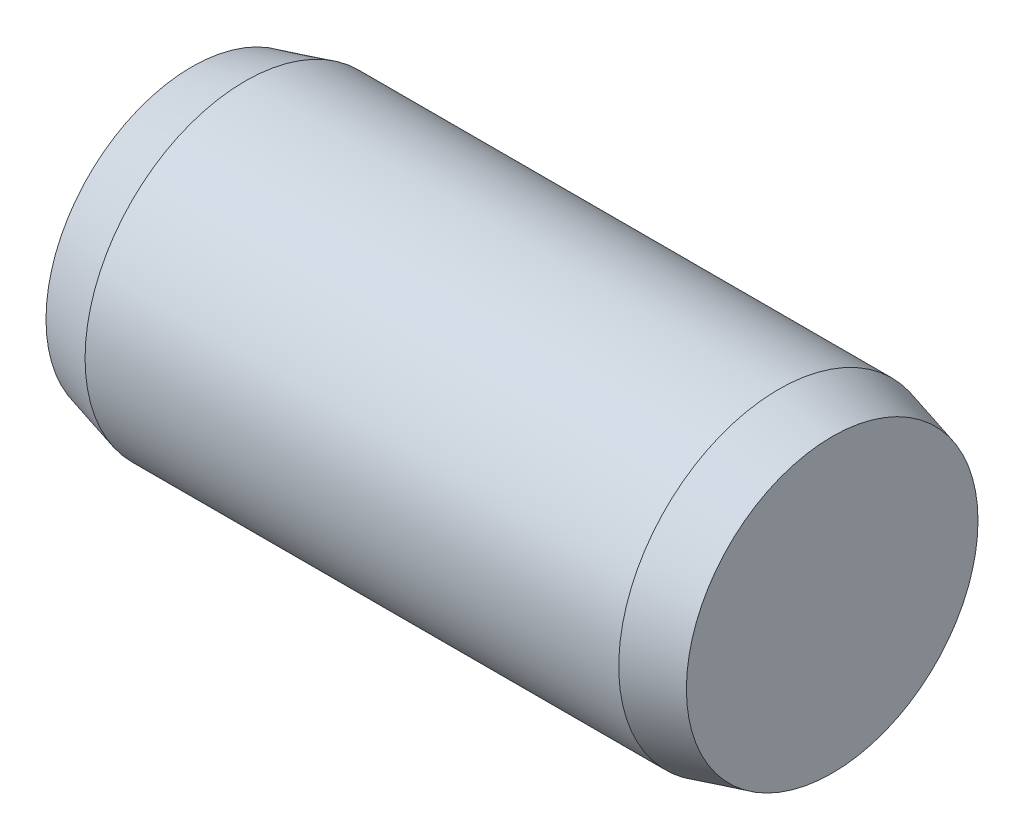
ISO-10303-21;
HEADER;
FILE_DESCRIPTION(('STEP AP214'),'2;1');
FILE_NAME('part.step','',(''),(''),'','','');
FILE_SCHEMA(('AUTOMOTIVE_DESIGN { 1 0 10303 214 1 1 1 1 }'));
ENDSEC;
DATA;
#1=APPLICATION_CONTEXT('core data for automotive mechanical design processes');
#2=APPLICATION_PROTOCOL_DEFINITION('international standard','automotive_design',2000,#1);
#3=PRODUCT_CONTEXT('',#1,'mechanical');
#4=PRODUCT('Part','Part','',(#3));
#5=PRODUCT_RELATED_PRODUCT_CATEGORY('part','',(#4));
#6=PRODUCT_DEFINITION_FORMATION('','',#4);
#7=PRODUCT_DEFINITION_CONTEXT('part definition',#1,'design');
#8=PRODUCT_DEFINITION('design','',#6,#7);
#9=PRODUCT_DEFINITION_SHAPE('','',#8);
#10=(LENGTH_UNIT() NAMED_UNIT(*) SI_UNIT(.MILLI.,.METRE.));
#11=(NAMED_UNIT(*) PLANE_ANGLE_UNIT() SI_UNIT($,.RADIAN.));
#12=(NAMED_UNIT(*) SI_UNIT($,.STERADIAN.) SOLID_ANGLE_UNIT());
#13=UNCERTAINTY_MEASURE_WITH_UNIT(LENGTH_MEASURE(1.E-05),#10,'distance_accuracy_value','');
#14=(GEOMETRIC_REPRESENTATION_CONTEXT(3) GLOBAL_UNCERTAINTY_ASSIGNED_CONTEXT((#13)) GLOBAL_UNIT_ASSIGNED_CONTEXT((#10,
#11,#12)) REPRESENTATION_CONTEXT('',''));
#15=CARTESIAN_POINT('',(0.,0.,0.));
#16=DIRECTION('',(0.,0.,1.));
#17=DIRECTION('',(1.,0.,0.));
#18=AXIS2_PLACEMENT_3D('',#15,#16,#17);
#19=CARTESIAN_POINT('',(-2.5,0.,0.));
#20=DIRECTION('',(1.,0.,0.));
#21=DIRECTION('',(0.,0.,-1.));
#22=AXIS2_PLACEMENT_3D('',#19,#20,#21);
#23=CYLINDRICAL_SURFACE('',#22,1.5);
#24=CARTESIAN_POINT('',(-2.5,0.,0.));
#25=DIRECTION('',(-1.,0.,0.));
#26=DIRECTION('',(0.,0.,1.));
#27=AXIS2_PLACEMENT_3D('',#24,#25,#26);
#28=CIRCLE('',#27,1.5);
#29=CARTESIAN_POINT('',(-2.5,0.,1.5));
#30=VERTEX_POINT('',#29);
#31=EDGE_CURVE('E44',#30,#30,#28,.T.);
#32=ORIENTED_EDGE('',*,*,#31,.F.);
#33=EDGE_LOOP('',(#32));
#34=FACE_BOUND('',#33,.T.);
#35=CARTESIAN_POINT('',(2.5,0.,0.));
#36=DIRECTION('',(1.,0.,0.));
#37=DIRECTION('',(0.,0.,-1.));
#38=AXIS2_PLACEMENT_3D('',#35,#36,#37);
#39=CIRCLE('',#38,1.5);
#40=CARTESIAN_POINT('',(2.5,0.,-1.5));
#41=VERTEX_POINT('',#40);
#42=EDGE_CURVE('E10',#41,#41,#39,.T.);
#43=ORIENTED_EDGE('',*,*,#42,.F.);
#44=EDGE_LOOP('',(#43));
#45=FACE_BOUND('',#44,.T.);
#46=ADVANCED_FACE('F30',(#34,#45),#23,.T.);
#47=CARTESIAN_POINT('',(2.5,0.,0.));
#48=DIRECTION('',(-1.,0.,0.));
#49=DIRECTION('',(0.,0.,-1.));
#50=AXIS2_PLACEMENT_3D('',#47,#48,#49);
#51=CONICAL_SURFACE('',#50,1.5,0.26179938779915);
#52=CARTESIAN_POINT('',(3.,0.,0.));
#53=DIRECTION('',(1.,0.,0.));
#54=DIRECTION('',(0.,0.,-1.));
#55=AXIS2_PLACEMENT_3D('',#52,#53,#54);
#56=CIRCLE('',#55,1.36602540378444);
#57=CARTESIAN_POINT('',(3.,0.,-1.36602540378444));
#58=VERTEX_POINT('',#57);
#59=EDGE_CURVE('E36',#58,#58,#56,.T.);
#60=ORIENTED_EDGE('',*,*,#59,.F.);
#61=EDGE_LOOP('',(#60));
#62=FACE_BOUND('',#61,.T.);
#63=ORIENTED_EDGE('',*,*,#42,.T.);
#64=EDGE_LOOP('',(#63));
#65=FACE_BOUND('',#64,.T.);
#66=ADVANCED_FACE('F54',(#62,#65),#51,.T.);
#67=CARTESIAN_POINT('',(3.,0.,0.));
#68=DIRECTION('',(1.,0.,0.));
#69=DIRECTION('',(0.,0.,-1.));
#70=AXIS2_PLACEMENT_3D('',#67,#68,#69);
#71=PLANE('',#70);
#72=ORIENTED_EDGE('',*,*,#59,.T.);
#73=EDGE_LOOP('',(#72));
#74=FACE_BOUND('',#73,.T.);
#75=ADVANCED_FACE('F58',(#74),#71,.T.);
#76=CARTESIAN_POINT('',(-2.5,0.,0.));
#77=DIRECTION('',(1.,0.,0.));
#78=DIRECTION('',(0.,0.,1.));
#79=AXIS2_PLACEMENT_3D('',#76,#77,#78);
#80=CONICAL_SURFACE('',#79,1.5,0.26179938779915);
#81=CARTESIAN_POINT('',(-3.,0.,0.));
#82=DIRECTION('',(-1.,0.,0.));
#83=DIRECTION('',(0.,0.,1.));
#84=AXIS2_PLACEMENT_3D('',#81,#82,#83);
#85=CIRCLE('',#84,1.36602540378444);
#86=CARTESIAN_POINT('',(-3.,0.,1.36602540378444));
#87=VERTEX_POINT('',#86);
#88=EDGE_CURVE('E40',#87,#87,#85,.T.);
#89=ORIENTED_EDGE('',*,*,#88,.F.);
#90=EDGE_LOOP('',(#89));
#91=FACE_BOUND('',#90,.T.);
#92=ORIENTED_EDGE('',*,*,#31,.T.);
#93=EDGE_LOOP('',(#92));
#94=FACE_BOUND('',#93,.T.);
#95=ADVANCED_FACE('F50',(#91,#94),#80,.T.);
#96=CARTESIAN_POINT('',(-3.,0.,0.));
#97=DIRECTION('',(-1.,0.,0.));
#98=DIRECTION('',(0.,0.,1.));
#99=AXIS2_PLACEMENT_3D('',#96,#97,#98);
#100=PLANE('',#99);
#101=ORIENTED_EDGE('',*,*,#88,.T.);
#102=EDGE_LOOP('',(#101));
#103=FACE_BOUND('',#102,.T.);
#104=ADVANCED_FACE('F67',(#103),#100,.T.);
#105=CLOSED_SHELL('',(#46,#66,#75,#95,#104));
#106=MANIFOLD_SOLID_BREP('B2',#105);
#107=ADVANCED_BREP_SHAPE_REPRESENTATION('',(#18,#106),#14);
#108=SHAPE_DEFINITION_REPRESENTATION(#9,#107);
ENDSEC;
END-ISO-10303-21;
